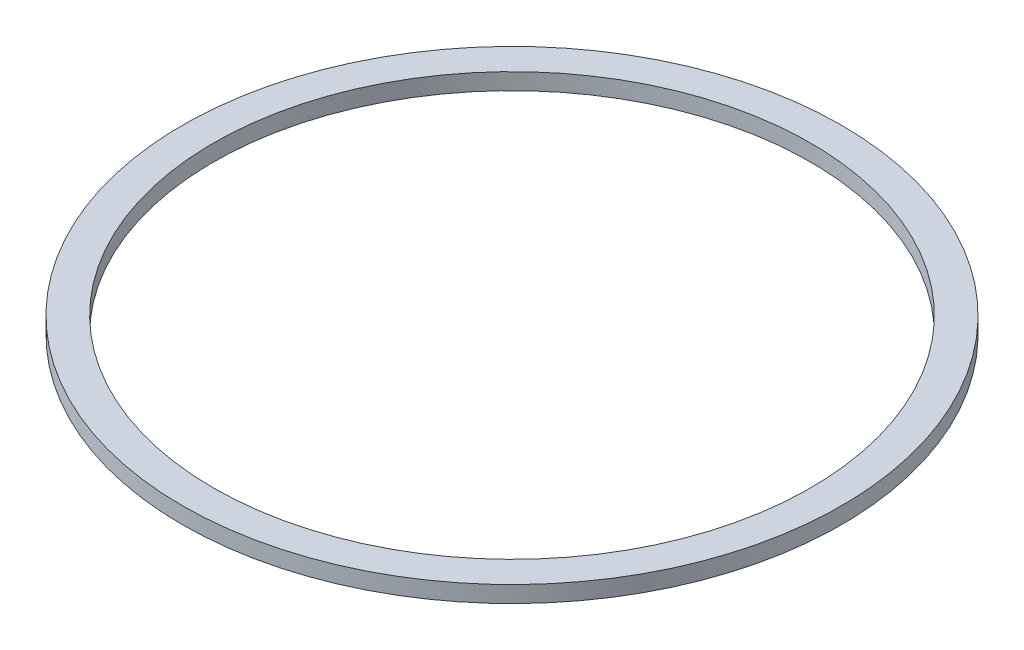
ISO-10303-21;
HEADER;
FILE_DESCRIPTION(('STEP AP214'),'2;1');
FILE_NAME('part.step','',(''),(''),'','','');
FILE_SCHEMA(('AUTOMOTIVE_DESIGN { 1 0 10303 214 1 1 1 1 }'));
ENDSEC;
DATA;
#1=APPLICATION_CONTEXT('core data for automotive mechanical design processes');
#2=APPLICATION_PROTOCOL_DEFINITION('international standard','automotive_design',2000,#1);
#3=PRODUCT_CONTEXT('',#1,'mechanical');
#4=PRODUCT('Part','Part','',(#3));
#5=PRODUCT_RELATED_PRODUCT_CATEGORY('part','',(#4));
#6=PRODUCT_DEFINITION_FORMATION('','',#4);
#7=PRODUCT_DEFINITION_CONTEXT('part definition',#1,'design');
#8=PRODUCT_DEFINITION('design','',#6,#7);
#9=PRODUCT_DEFINITION_SHAPE('','',#8);
#10=(LENGTH_UNIT() NAMED_UNIT(*) SI_UNIT(.MILLI.,.METRE.));
#11=(NAMED_UNIT(*) PLANE_ANGLE_UNIT() SI_UNIT($,.RADIAN.));
#12=(NAMED_UNIT(*) SI_UNIT($,.STERADIAN.) SOLID_ANGLE_UNIT());
#13=UNCERTAINTY_MEASURE_WITH_UNIT(LENGTH_MEASURE(1.E-05),#10,'distance_accuracy_value','');
#14=(GEOMETRIC_REPRESENTATION_CONTEXT(3) GLOBAL_UNCERTAINTY_ASSIGNED_CONTEXT((#13)) GLOBAL_UNIT_ASSIGNED_CONTEXT((#10,
#11,#12)) REPRESENTATION_CONTEXT('',''));
#15=CARTESIAN_POINT('',(0.,0.,0.));
#16=DIRECTION('',(0.,0.,1.));
#17=DIRECTION('',(1.,0.,0.));
#18=AXIS2_PLACEMENT_3D('',#15,#16,#17);
#19=CARTESIAN_POINT('',(0.,4.,0.));
#20=DIRECTION('',(0.,1.,0.));
#21=DIRECTION('',(0.,0.,1.));
#22=AXIS2_PLACEMENT_3D('',#19,#20,#21);
#23=PLANE('',#22);
#24=CARTESIAN_POINT('',(0.,4.,0.));
#25=DIRECTION('',(0.,1.,0.));
#26=DIRECTION('',(0.,0.,1.));
#27=AXIS2_PLACEMENT_3D('',#24,#25,#26);
#28=CIRCLE('',#27,80.);
#29=CARTESIAN_POINT('',(0.,4.,80.));
#30=VERTEX_POINT('',#29);
#31=EDGE_CURVE('E10',#30,#30,#28,.T.);
#32=ORIENTED_EDGE('',*,*,#31,.T.);
#33=EDGE_LOOP('',(#32));
#34=FACE_BOUND('',#33,.T.);
#35=CARTESIAN_POINT('',(0.,4.,0.));
#36=DIRECTION('',(0.,1.,0.));
#37=DIRECTION('',(0.,0.,1.));
#38=AXIS2_PLACEMENT_3D('',#35,#36,#37);
#39=CIRCLE('',#38,72.5);
#40=CARTESIAN_POINT('',(0.,4.,72.5));
#41=VERTEX_POINT('',#40);
#42=EDGE_CURVE('E50',#41,#41,#39,.T.);
#43=ORIENTED_EDGE('',*,*,#42,.F.);
#44=EDGE_LOOP('',(#43));
#45=FACE_BOUND('',#44,.T.);
#46=ADVANCED_FACE('F37',(#34,#45),#23,.T.);
#47=CARTESIAN_POINT('',(0.,0.,0.));
#48=DIRECTION('',(0.,1.,0.));
#49=DIRECTION('',(0.,0.,1.));
#50=AXIS2_PLACEMENT_3D('',#47,#48,#49);
#51=PLANE('',#50);
#52=CARTESIAN_POINT('',(0.,0.,0.));
#53=DIRECTION('',(0.,1.,0.));
#54=DIRECTION('',(0.,0.,1.));
#55=AXIS2_PLACEMENT_3D('',#52,#53,#54);
#56=CIRCLE('',#55,80.);
#57=CARTESIAN_POINT('',(0.,0.,80.));
#58=VERTEX_POINT('',#57);
#59=EDGE_CURVE('E41',#58,#58,#56,.T.);
#60=ORIENTED_EDGE('',*,*,#59,.F.);
#61=EDGE_LOOP('',(#60));
#62=FACE_BOUND('',#61,.T.);
#63=CARTESIAN_POINT('',(0.,0.,0.));
#64=DIRECTION('',(0.,1.,0.));
#65=DIRECTION('',(0.,0.,1.));
#66=AXIS2_PLACEMENT_3D('',#63,#64,#65);
#67=CIRCLE('',#66,72.5);
#68=CARTESIAN_POINT('',(0.,0.,72.5));
#69=VERTEX_POINT('',#68);
#70=EDGE_CURVE('E52',#69,#69,#67,.T.);
#71=ORIENTED_EDGE('',*,*,#70,.T.);
#72=EDGE_LOOP('',(#71));
#73=FACE_BOUND('',#72,.T.);
#74=ADVANCED_FACE('F64',(#62,#73),#51,.F.);
#75=CARTESIAN_POINT('',(0.,4.,0.));
#76=DIRECTION('',(0.,-1.,0.));
#77=DIRECTION('',(0.,0.,-1.));
#78=AXIS2_PLACEMENT_3D('',#75,#76,#77);
#79=CYLINDRICAL_SURFACE('',#78,80.);
#80=ORIENTED_EDGE('',*,*,#31,.F.);
#81=EDGE_LOOP('',(#80));
#82=FACE_BOUND('',#81,.T.);
#83=ORIENTED_EDGE('',*,*,#59,.T.);
#84=EDGE_LOOP('',(#83));
#85=FACE_BOUND('',#84,.T.);
#86=ADVANCED_FACE('F39',(#82,#85),#79,.T.);
#87=CARTESIAN_POINT('',(0.,4.,0.));
#88=DIRECTION('',(0.,-1.,0.));
#89=DIRECTION('',(0.,0.,-1.));
#90=AXIS2_PLACEMENT_3D('',#87,#88,#89);
#91=CYLINDRICAL_SURFACE('',#90,72.5);
#92=ORIENTED_EDGE('',*,*,#42,.T.);
#93=EDGE_LOOP('',(#92));
#94=FACE_BOUND('',#93,.T.);
#95=ORIENTED_EDGE('',*,*,#70,.F.);
#96=EDGE_LOOP('',(#95));
#97=FACE_BOUND('',#96,.T.);
#98=ADVANCED_FACE('F60',(#94,#97),#91,.F.);
#99=CLOSED_SHELL('',(#46,#74,#86,#98));
#100=MANIFOLD_SOLID_BREP('B2',#99);
#101=ADVANCED_BREP_SHAPE_REPRESENTATION('',(#18,#100),#14);
#102=SHAPE_DEFINITION_REPRESENTATION(#9,#101);
ENDSEC;
END-ISO-10303-21;
